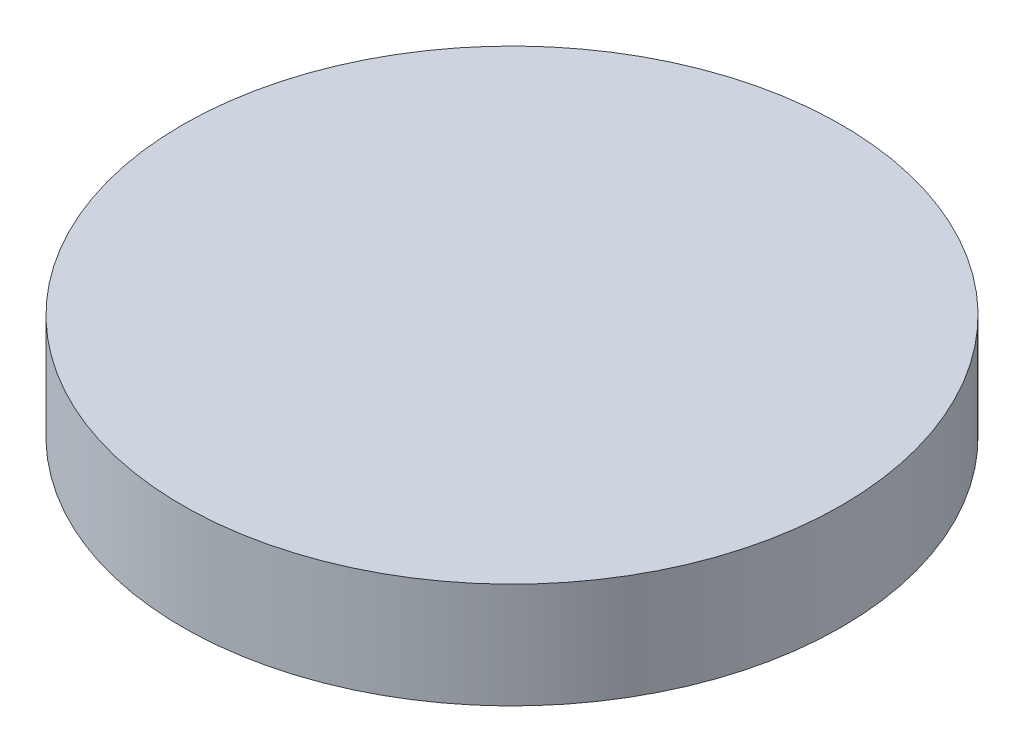
ISO-10303-21;
HEADER;
FILE_DESCRIPTION(('STEP AP214'),'2;1');
FILE_NAME('part.step','',(''),(''),'','','');
FILE_SCHEMA(('AUTOMOTIVE_DESIGN { 1 0 10303 214 1 1 1 1 }'));
ENDSEC;
DATA;
#1=APPLICATION_CONTEXT('core data for automotive mechanical design processes');
#2=APPLICATION_PROTOCOL_DEFINITION('international standard','automotive_design',2000,#1);
#3=PRODUCT_CONTEXT('',#1,'mechanical');
#4=PRODUCT('Part','Part','',(#3));
#5=PRODUCT_RELATED_PRODUCT_CATEGORY('part','',(#4));
#6=PRODUCT_DEFINITION_FORMATION('','',#4);
#7=PRODUCT_DEFINITION_CONTEXT('part definition',#1,'design');
#8=PRODUCT_DEFINITION('design','',#6,#7);
#9=PRODUCT_DEFINITION_SHAPE('','',#8);
#10=(LENGTH_UNIT() NAMED_UNIT(*) SI_UNIT(.MILLI.,.METRE.));
#11=(NAMED_UNIT(*) PLANE_ANGLE_UNIT() SI_UNIT($,.RADIAN.));
#12=(NAMED_UNIT(*) SI_UNIT($,.STERADIAN.) SOLID_ANGLE_UNIT());
#13=UNCERTAINTY_MEASURE_WITH_UNIT(LENGTH_MEASURE(1.E-05),#10,'distance_accuracy_value','');
#14=(GEOMETRIC_REPRESENTATION_CONTEXT(3) GLOBAL_UNCERTAINTY_ASSIGNED_CONTEXT((#13)) GLOBAL_UNIT_ASSIGNED_CONTEXT((#10,
#11,#12)) REPRESENTATION_CONTEXT('',''));
#15=CARTESIAN_POINT('',(0.,0.,0.));
#16=DIRECTION('',(0.,0.,1.));
#17=DIRECTION('',(1.,0.,0.));
#18=AXIS2_PLACEMENT_3D('',#15,#16,#17);
#19=CARTESIAN_POINT('',(0.,-4.,0.));
#20=DIRECTION('',(0.,-1.,0.));
#21=DIRECTION('',(1.,0.,0.));
#22=AXIS2_PLACEMENT_3D('',#19,#20,#21);
#23=PLANE('',#22);
#24=CARTESIAN_POINT('',(0.,-4.,0.));
#25=DIRECTION('',(0.,1.,0.));
#26=DIRECTION('',(-1.,0.,0.));
#27=AXIS2_PLACEMENT_3D('',#24,#25,#26);
#28=CIRCLE('',#27,12.5);
#29=CARTESIAN_POINT('',(-12.5,-4.,0.));
#30=VERTEX_POINT('',#29);
#31=EDGE_CURVE('E10',#30,#30,#28,.T.);
#32=ORIENTED_EDGE('',*,*,#31,.F.);
#33=EDGE_LOOP('',(#32));
#34=FACE_BOUND('',#33,.T.);
#35=ADVANCED_FACE('F37',(#34),#23,.T.);
#36=CARTESIAN_POINT('',(0.,0.,0.));
#37=DIRECTION('',(0.,1.,0.));
#38=DIRECTION('',(-1.,0.,0.));
#39=AXIS2_PLACEMENT_3D('',#36,#37,#38);
#40=CYLINDRICAL_SURFACE('',#39,12.5);
#41=ORIENTED_EDGE('',*,*,#31,.T.);
#42=EDGE_LOOP('',(#41));
#43=FACE_BOUND('',#42,.T.);
#44=CARTESIAN_POINT('',(0.,0.,0.));
#45=DIRECTION('',(0.,1.,0.));
#46=DIRECTION('',(-1.,0.,0.));
#47=AXIS2_PLACEMENT_3D('',#44,#45,#46);
#48=CIRCLE('',#47,12.5);
#49=CARTESIAN_POINT('',(-12.5,0.,0.));
#50=VERTEX_POINT('',#49);
#51=EDGE_CURVE('E44',#50,#50,#48,.T.);
#52=ORIENTED_EDGE('',*,*,#51,.F.);
#53=EDGE_LOOP('',(#52));
#54=FACE_BOUND('',#53,.T.);
#55=ADVANCED_FACE('F53',(#43,#54),#40,.T.);
#56=CARTESIAN_POINT('',(0.,0.,0.));
#57=DIRECTION('',(0.,1.,0.));
#58=DIRECTION('',(-1.,0.,0.));
#59=AXIS2_PLACEMENT_3D('',#56,#57,#58);
#60=PLANE('',#59);
#61=ORIENTED_EDGE('',*,*,#51,.T.);
#62=EDGE_LOOP('',(#61));
#63=FACE_BOUND('',#62,.T.);
#64=ADVANCED_FACE('F51',(#63),#60,.T.);
#65=CLOSED_SHELL('',(#35,#55,#64));
#66=MANIFOLD_SOLID_BREP('B2',#65);
#67=ADVANCED_BREP_SHAPE_REPRESENTATION('',(#18,#66),#14);
#68=SHAPE_DEFINITION_REPRESENTATION(#9,#67);
ENDSEC;
END-ISO-10303-21;
